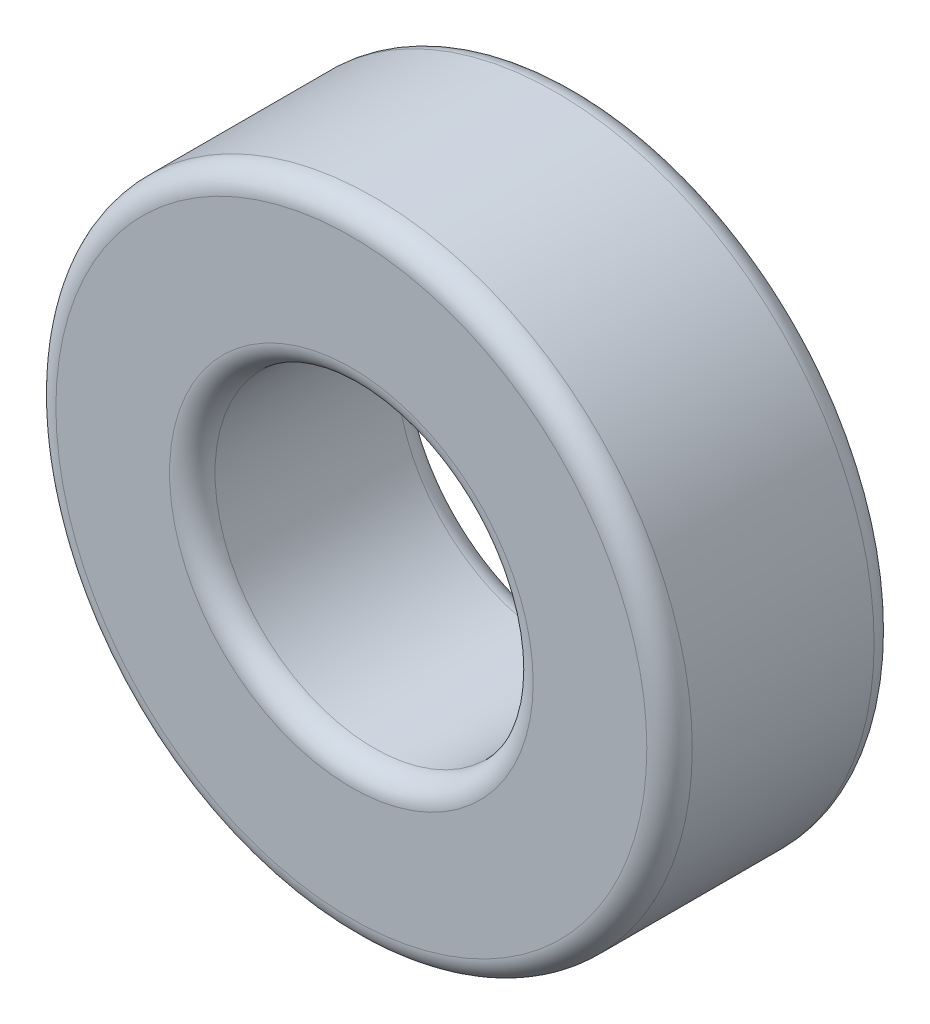
ISO-10303-21;
HEADER;
FILE_DESCRIPTION(('STEP AP214'),'2;1');
FILE_NAME('part.step','',(''),(''),'','','');
FILE_SCHEMA(('AUTOMOTIVE_DESIGN { 1 0 10303 214 1 1 1 1 }'));
ENDSEC;
DATA;
#1=APPLICATION_CONTEXT('core data for automotive mechanical design processes');
#2=APPLICATION_PROTOCOL_DEFINITION('international standard','automotive_design',2000,#1);
#3=PRODUCT_CONTEXT('',#1,'mechanical');
#4=PRODUCT('Part','Part','',(#3));
#5=PRODUCT_RELATED_PRODUCT_CATEGORY('part','',(#4));
#6=PRODUCT_DEFINITION_FORMATION('','',#4);
#7=PRODUCT_DEFINITION_CONTEXT('part definition',#1,'design');
#8=PRODUCT_DEFINITION('design','',#6,#7);
#9=PRODUCT_DEFINITION_SHAPE('','',#8);
#10=(LENGTH_UNIT() NAMED_UNIT(*) SI_UNIT(.MILLI.,.METRE.));
#11=(NAMED_UNIT(*) PLANE_ANGLE_UNIT() SI_UNIT($,.RADIAN.));
#12=(NAMED_UNIT(*) SI_UNIT($,.STERADIAN.) SOLID_ANGLE_UNIT());
#13=UNCERTAINTY_MEASURE_WITH_UNIT(LENGTH_MEASURE(1.E-05),#10,'distance_accuracy_value','');
#14=(GEOMETRIC_REPRESENTATION_CONTEXT(3) GLOBAL_UNCERTAINTY_ASSIGNED_CONTEXT((#13)) GLOBAL_UNIT_ASSIGNED_CONTEXT((#10,
#11,#12)) REPRESENTATION_CONTEXT('',''));
#15=CARTESIAN_POINT('',(0.,0.,0.));
#16=DIRECTION('',(0.,0.,1.));
#17=DIRECTION('',(1.,0.,0.));
#18=AXIS2_PLACEMENT_3D('',#15,#16,#17);
#19=CARTESIAN_POINT('',(0.,0.,5.));
#20=DIRECTION('',(0.,0.,1.));
#21=DIRECTION('',(1.,0.,0.));
#22=AXIS2_PLACEMENT_3D('',#19,#20,#21);
#23=PLANE('',#22);
#24=CARTESIAN_POINT('',(0.,0.,5.));
#25=DIRECTION('',(0.,0.,1.));
#26=DIRECTION('',(1.,0.,0.));
#27=AXIS2_PLACEMENT_3D('',#24,#25,#26);
#28=CIRCLE('',#27,4.);
#29=CARTESIAN_POINT('',(4.,0.,5.));
#30=VERTEX_POINT('',#29);
#31=EDGE_CURVE('E10',#30,#30,#28,.F.);
#32=ORIENTED_EDGE('',*,*,#31,.T.);
#33=EDGE_LOOP('',(#32));
#34=FACE_BOUND('',#33,.T.);
#35=CARTESIAN_POINT('',(0.,0.,5.));
#36=DIRECTION('',(0.,0.,1.));
#37=DIRECTION('',(1.,0.,0.));
#38=AXIS2_PLACEMENT_3D('',#35,#36,#37);
#39=CIRCLE('',#38,6.5);
#40=CARTESIAN_POINT('',(6.5,0.,5.));
#41=VERTEX_POINT('',#40);
#42=EDGE_CURVE('E40',#41,#41,#39,.T.);
#43=ORIENTED_EDGE('',*,*,#42,.T.);
#44=EDGE_LOOP('',(#43));
#45=FACE_BOUND('',#44,.T.);
#46=ADVANCED_FACE('F33',(#34,#45),#23,.T.);
#47=CARTESIAN_POINT('',(0.,0.,0.));
#48=DIRECTION('',(0.,0.,1.));
#49=DIRECTION('',(1.,0.,0.));
#50=AXIS2_PLACEMENT_3D('',#47,#48,#49);
#51=PLANE('',#50);
#52=CARTESIAN_POINT('',(0.,0.,0.));
#53=DIRECTION('',(0.,0.,1.));
#54=DIRECTION('',(1.,0.,0.));
#55=AXIS2_PLACEMENT_3D('',#52,#53,#54);
#56=CIRCLE('',#55,4.);
#57=CARTESIAN_POINT('',(4.,0.,0.));
#58=VERTEX_POINT('',#57);
#59=EDGE_CURVE('E59',#58,#58,#56,.T.);
#60=ORIENTED_EDGE('',*,*,#59,.T.);
#61=EDGE_LOOP('',(#60));
#62=FACE_BOUND('',#61,.T.);
#63=CARTESIAN_POINT('',(0.,0.,0.));
#64=DIRECTION('',(0.,0.,1.));
#65=DIRECTION('',(1.,0.,0.));
#66=AXIS2_PLACEMENT_3D('',#63,#64,#65);
#67=CIRCLE('',#66,6.5);
#68=CARTESIAN_POINT('',(6.5,0.,0.));
#69=VERTEX_POINT('',#68);
#70=EDGE_CURVE('E62',#69,#69,#67,.F.);
#71=ORIENTED_EDGE('',*,*,#70,.T.);
#72=EDGE_LOOP('',(#71));
#73=FACE_BOUND('',#72,.T.);
#74=ADVANCED_FACE('F66',(#62,#73),#51,.F.);
#75=CARTESIAN_POINT('',(0.,0.,5.));
#76=DIRECTION('',(0.,0.,-1.));
#77=DIRECTION('',(-1.,0.,0.));
#78=AXIS2_PLACEMENT_3D('',#75,#76,#77);
#79=CYLINDRICAL_SURFACE('',#78,7.);
#80=CARTESIAN_POINT('',(0.,0.,0.5));
#81=DIRECTION('',(0.,0.,1.));
#82=DIRECTION('',(1.,0.,0.));
#83=AXIS2_PLACEMENT_3D('',#80,#81,#82);
#84=CIRCLE('',#83,7.);
#85=CARTESIAN_POINT('',(7.,0.,0.5));
#86=VERTEX_POINT('',#85);
#87=EDGE_CURVE('E44',#86,#86,#84,.T.);
#88=ORIENTED_EDGE('',*,*,#87,.T.);
#89=EDGE_LOOP('',(#88));
#90=FACE_BOUND('',#89,.T.);
#91=CARTESIAN_POINT('',(0.,0.,4.5));
#92=DIRECTION('',(0.,0.,1.));
#93=DIRECTION('',(1.,0.,0.));
#94=AXIS2_PLACEMENT_3D('',#91,#92,#93);
#95=CIRCLE('',#94,7.);
#96=CARTESIAN_POINT('',(7.,0.,4.5));
#97=VERTEX_POINT('',#96);
#98=EDGE_CURVE('E48',#97,#97,#95,.F.);
#99=ORIENTED_EDGE('',*,*,#98,.T.);
#100=EDGE_LOOP('',(#99));
#101=FACE_BOUND('',#100,.T.);
#102=ADVANCED_FACE('F76',(#90,#101),#79,.T.);
#103=CARTESIAN_POINT('',(0.,0.,5.));
#104=DIRECTION('',(0.,0.,-1.));
#105=DIRECTION('',(-1.,0.,0.));
#106=AXIS2_PLACEMENT_3D('',#103,#104,#105);
#107=CYLINDRICAL_SURFACE('',#106,3.5);
#108=CARTESIAN_POINT('',(0.,0.,0.5));
#109=DIRECTION('',(0.,0.,1.));
#110=DIRECTION('',(1.,0.,0.));
#111=AXIS2_PLACEMENT_3D('',#108,#109,#110);
#112=CIRCLE('',#111,3.5);
#113=CARTESIAN_POINT('',(3.5,0.,0.5));
#114=VERTEX_POINT('',#113);
#115=EDGE_CURVE('E53',#114,#114,#112,.F.);
#116=ORIENTED_EDGE('',*,*,#115,.T.);
#117=EDGE_LOOP('',(#116));
#118=FACE_BOUND('',#117,.T.);
#119=CARTESIAN_POINT('',(0.,0.,4.5));
#120=DIRECTION('',(0.,0.,1.));
#121=DIRECTION('',(1.,0.,0.));
#122=AXIS2_PLACEMENT_3D('',#119,#120,#121);
#123=CIRCLE('',#122,3.5);
#124=CARTESIAN_POINT('',(3.5,0.,4.5));
#125=VERTEX_POINT('',#124);
#126=EDGE_CURVE('E56',#125,#125,#123,.T.);
#127=ORIENTED_EDGE('',*,*,#126,.T.);
#128=EDGE_LOOP('',(#127));
#129=FACE_BOUND('',#128,.T.);
#130=ADVANCED_FACE('F79',(#118,#129),#107,.F.);
#131=CARTESIAN_POINT('',(0.,0.,0.5));
#132=DIRECTION('',(0.,0.,1.));
#133=DIRECTION('',(1.,0.,0.));
#134=AXIS2_PLACEMENT_3D('',#131,#132,#133);
#135=TOROIDAL_SURFACE('',#134,4.,0.5);
#136=ORIENTED_EDGE('',*,*,#115,.F.);
#137=EDGE_LOOP('',(#136));
#138=FACE_BOUND('',#137,.T.);
#139=ORIENTED_EDGE('',*,*,#59,.F.);
#140=EDGE_LOOP('',(#139));
#141=FACE_BOUND('',#140,.T.);
#142=ADVANCED_FACE('F72',(#138,#141),#135,.T.);
#143=CARTESIAN_POINT('',(0.,0.,0.5));
#144=DIRECTION('',(0.,0.,1.));
#145=DIRECTION('',(1.,0.,0.));
#146=AXIS2_PLACEMENT_3D('',#143,#144,#145);
#147=TOROIDAL_SURFACE('',#146,6.5,0.5);
#148=ORIENTED_EDGE('',*,*,#70,.F.);
#149=EDGE_LOOP('',(#148));
#150=FACE_BOUND('',#149,.T.);
#151=ORIENTED_EDGE('',*,*,#87,.F.);
#152=EDGE_LOOP('',(#151));
#153=FACE_BOUND('',#152,.T.);
#154=ADVANCED_FACE('F68',(#150,#153),#147,.T.);
#155=CARTESIAN_POINT('',(0.,0.,4.5));
#156=DIRECTION('',(0.,0.,1.));
#157=DIRECTION('',(1.,0.,0.));
#158=AXIS2_PLACEMENT_3D('',#155,#156,#157);
#159=TOROIDAL_SURFACE('',#158,4.,0.5);
#160=ORIENTED_EDGE('',*,*,#31,.F.);
#161=EDGE_LOOP('',(#160));
#162=FACE_BOUND('',#161,.T.);
#163=ORIENTED_EDGE('',*,*,#126,.F.);
#164=EDGE_LOOP('',(#163));
#165=FACE_BOUND('',#164,.T.);
#166=ADVANCED_FACE('F71',(#162,#165),#159,.T.);
#167=CARTESIAN_POINT('',(0.,0.,4.5));
#168=DIRECTION('',(0.,0.,1.));
#169=DIRECTION('',(1.,0.,0.));
#170=AXIS2_PLACEMENT_3D('',#167,#168,#169);
#171=TOROIDAL_SURFACE('',#170,6.5,0.5);
#172=ORIENTED_EDGE('',*,*,#98,.F.);
#173=EDGE_LOOP('',(#172));
#174=FACE_BOUND('',#173,.T.);
#175=ORIENTED_EDGE('',*,*,#42,.F.);
#176=EDGE_LOOP('',(#175));
#177=FACE_BOUND('',#176,.T.);
#178=ADVANCED_FACE('F35',(#174,#177),#171,.T.);
#179=CLOSED_SHELL('',(#46,#74,#102,#130,#142,#154,#166,#178));
#180=MANIFOLD_SOLID_BREP('B2',#179);
#181=ADVANCED_BREP_SHAPE_REPRESENTATION('',(#18,#180),#14);
#182=SHAPE_DEFINITION_REPRESENTATION(#9,#181);
ENDSEC;
END-ISO-10303-21;
